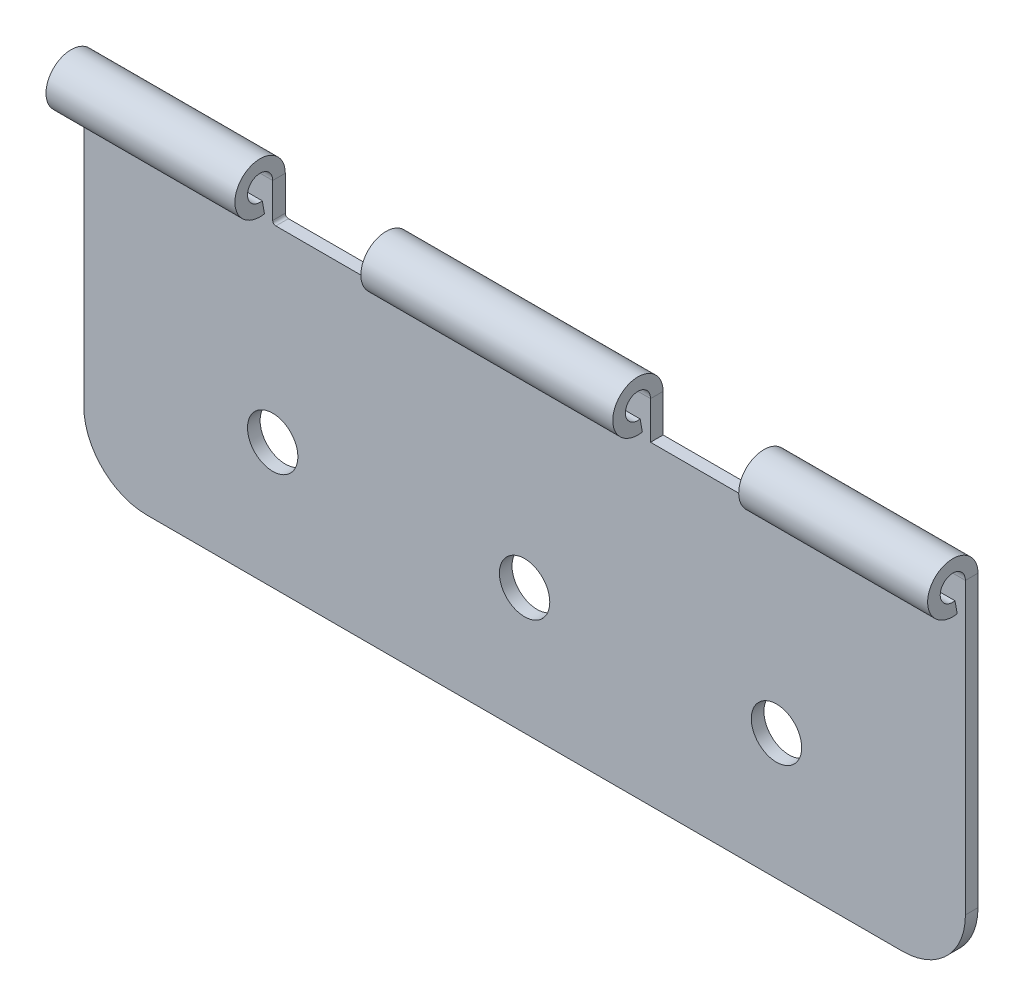
ISO-10303-21;
HEADER;
FILE_DESCRIPTION(('STEP AP214'),'2;1');
FILE_NAME('part.step','',(''),(''),'','','');
FILE_SCHEMA(('AUTOMOTIVE_DESIGN { 1 0 10303 214 1 1 1 1 }'));
ENDSEC;
DATA;
#1=APPLICATION_CONTEXT('core data for automotive mechanical design processes');
#2=APPLICATION_PROTOCOL_DEFINITION('international standard','automotive_design',2000,#1);
#3=PRODUCT_CONTEXT('',#1,'mechanical');
#4=PRODUCT('Part','Part','',(#3));
#5=PRODUCT_RELATED_PRODUCT_CATEGORY('part','',(#4));
#6=PRODUCT_DEFINITION_FORMATION('','',#4);
#7=PRODUCT_DEFINITION_CONTEXT('part definition',#1,'design');
#8=PRODUCT_DEFINITION('design','',#6,#7);
#9=PRODUCT_DEFINITION_SHAPE('','',#8);
#10=(LENGTH_UNIT() NAMED_UNIT(*) SI_UNIT(.MILLI.,.METRE.));
#11=(NAMED_UNIT(*) PLANE_ANGLE_UNIT() SI_UNIT($,.RADIAN.));
#12=(NAMED_UNIT(*) SI_UNIT($,.STERADIAN.) SOLID_ANGLE_UNIT());
#13=UNCERTAINTY_MEASURE_WITH_UNIT(LENGTH_MEASURE(1.E-05),#10,'distance_accuracy_value','');
#14=(GEOMETRIC_REPRESENTATION_CONTEXT(3) GLOBAL_UNCERTAINTY_ASSIGNED_CONTEXT((#13)) GLOBAL_UNIT_ASSIGNED_CONTEXT((#10,
#11,#12)) REPRESENTATION_CONTEXT('',''));
#15=CARTESIAN_POINT('',(0.,0.,0.));
#16=DIRECTION('',(0.,0.,1.));
#17=DIRECTION('',(1.,0.,0.));
#18=AXIS2_PLACEMENT_3D('',#15,#16,#17);
#19=CARTESIAN_POINT('',(55.,25.,-1.));
#20=DIRECTION('',(-1.,0.,0.));
#21=DIRECTION('',(0.,0.,1.));
#22=AXIS2_PLACEMENT_3D('',#19,#20,#21);
#23=PLANE('',#22);
#24=DIRECTION('',(0.,-1.,0.));
#25=VECTOR('',#24,1.);
#26=CARTESIAN_POINT('',(55.,25.,0.));
#27=LINE('',#26,#25);
#28=CARTESIAN_POINT('',(55.,28.,0.));
#29=VERTEX_POINT('',#28);
#30=CARTESIAN_POINT('',(55.,25.,0.));
#31=VERTEX_POINT('',#30);
#32=EDGE_CURVE('E347',#29,#31,#27,.T.);
#33=ORIENTED_EDGE('',*,*,#32,.F.);
#34=DIRECTION('',(0.,0.,-1.));
#35=VECTOR('',#34,1.);
#36=CARTESIAN_POINT('',(55.,28.,0.));
#37=LINE('',#36,#35);
#38=CARTESIAN_POINT('',(55.,28.,-1.));
#39=VERTEX_POINT('',#38);
#40=EDGE_CURVE('E205',#29,#39,#37,.T.);
#41=ORIENTED_EDGE('',*,*,#40,.T.);
#42=DIRECTION('',(0.,-1.,0.));
#43=VECTOR('',#42,1.);
#44=CARTESIAN_POINT('',(55.,25.,-1.));
#45=LINE('',#44,#43);
#46=CARTESIAN_POINT('',(55.,25.,-1.));
#47=VERTEX_POINT('',#46);
#48=EDGE_CURVE('E193',#39,#47,#45,.T.);
#49=ORIENTED_EDGE('',*,*,#48,.T.);
#50=DIRECTION('',(0.,0.,1.));
#51=VECTOR('',#50,1.);
#52=CARTESIAN_POINT('',(55.,25.,-1.));
#53=LINE('',#52,#51);
#54=EDGE_CURVE('E342',#47,#31,#53,.T.);
#55=ORIENTED_EDGE('',*,*,#54,.T.);
#56=EDGE_LOOP('',(#33,#41,#49,#55));
#57=FACE_BOUND('',#56,.T.);
#58=ADVANCED_FACE('F37',(#57),#23,.T.);
#59=CARTESIAN_POINT('',(25.,25.,-1.));
#60=DIRECTION('',(-1.,0.,0.));
#61=DIRECTION('',(0.,-1.,0.));
#62=AXIS2_PLACEMENT_3D('',#59,#60,#61);
#63=PLANE('',#62);
#64=DIRECTION('',(0.,-1.,0.));
#65=VECTOR('',#64,1.);
#66=CARTESIAN_POINT('',(25.,25.,-1.));
#67=LINE('',#66,#65);
#68=CARTESIAN_POINT('',(25.,28.,-1.));
#69=VERTEX_POINT('',#68);
#70=CARTESIAN_POINT('',(25.,25.25,-1.));
#71=VERTEX_POINT('',#70);
#72=EDGE_CURVE('E332',#69,#71,#67,.T.);
#73=ORIENTED_EDGE('',*,*,#72,.T.);
#74=DIRECTION('',(0.,0.,1.));
#75=VECTOR('',#74,1.);
#76=CARTESIAN_POINT('',(25.,25.25,0.));
#77=LINE('',#76,#75);
#78=CARTESIAN_POINT('',(25.,25.25,0.));
#79=VERTEX_POINT('',#78);
#80=EDGE_CURVE('E367',#71,#79,#77,.T.);
#81=ORIENTED_EDGE('',*,*,#80,.T.);
#82=DIRECTION('',(0.,-1.,0.));
#83=VECTOR('',#82,1.);
#84=CARTESIAN_POINT('',(25.,25.,0.));
#85=LINE('',#84,#83);
#86=CARTESIAN_POINT('',(25.,28.,0.));
#87=VERTEX_POINT('',#86);
#88=EDGE_CURVE('E355',#87,#79,#85,.T.);
#89=ORIENTED_EDGE('',*,*,#88,.F.);
#90=DIRECTION('',(0.,0.,-1.));
#91=VECTOR('',#90,1.);
#92=CARTESIAN_POINT('',(25.,28.,0.));
#93=LINE('',#92,#91);
#94=EDGE_CURVE('E247',#87,#69,#93,.T.);
#95=ORIENTED_EDGE('',*,*,#94,.T.);
#96=EDGE_LOOP('',(#73,#81,#89,#95));
#97=FACE_BOUND('',#96,.T.);
#98=ADVANCED_FACE('F444',(#97),#63,.T.);
#99=CARTESIAN_POINT('',(0.,0.,-1.));
#100=DIRECTION('',(-1.,0.,0.));
#101=DIRECTION('',(0.,0.,1.));
#102=AXIS2_PLACEMENT_3D('',#99,#100,#101);
#103=PLANE('',#102);
#104=DIRECTION('',(0.,-1.,0.));
#105=VECTOR('',#104,1.);
#106=CARTESIAN_POINT('',(0.,0.,-1.));
#107=LINE('',#106,#105);
#108=CARTESIAN_POINT('',(0.,28.,-1.));
#109=VERTEX_POINT('',#108);
#110=CARTESIAN_POINT('',(0.,5.,-1.));
#111=VERTEX_POINT('',#110);
#112=EDGE_CURVE('E340',#109,#111,#107,.T.);
#113=ORIENTED_EDGE('',*,*,#112,.T.);
#114=DIRECTION('',(0.,0.,1.));
#115=VECTOR('',#114,1.);
#116=CARTESIAN_POINT('',(0.,5.,-1.));
#117=LINE('',#116,#115);
#118=CARTESIAN_POINT('',(0.,5.,0.));
#119=VERTEX_POINT('',#118);
#120=EDGE_CURVE('E11',#111,#119,#117,.T.);
#121=ORIENTED_EDGE('',*,*,#120,.T.);
#122=DIRECTION('',(0.,-1.,0.));
#123=VECTOR('',#122,1.);
#124=CARTESIAN_POINT('',(0.,0.,0.));
#125=LINE('',#124,#123);
#126=CARTESIAN_POINT('',(0.,28.,0.));
#127=VERTEX_POINT('',#126);
#128=EDGE_CURVE('E323',#127,#119,#125,.T.);
#129=ORIENTED_EDGE('',*,*,#128,.F.);
#130=DIRECTION('',(0.,0.,-1.));
#131=VECTOR('',#130,1.);
#132=CARTESIAN_POINT('',(0.,28.,0.));
#133=LINE('',#132,#131);
#134=EDGE_CURVE('E278',#127,#109,#133,.T.);
#135=ORIENTED_EDGE('',*,*,#134,.T.);
#136=EDGE_LOOP('',(#113,#121,#129,#135));
#137=FACE_BOUND('',#136,.T.);
#138=ADVANCED_FACE('F411',(#137),#103,.T.);
#139=CARTESIAN_POINT('',(70.,0.,-1.));
#140=DIRECTION('',(0.,-1.,0.));
#141=DIRECTION('',(0.,0.,-1.));
#142=AXIS2_PLACEMENT_3D('',#139,#140,#141);
#143=PLANE('',#142);
#144=DIRECTION('',(1.,0.,0.));
#145=VECTOR('',#144,1.);
#146=CARTESIAN_POINT('',(70.,0.,-1.));
#147=LINE('',#146,#145);
#148=CARTESIAN_POINT('',(5.,0.,-1.));
#149=VERTEX_POINT('',#148);
#150=CARTESIAN_POINT('',(65.,0.,-1.));
#151=VERTEX_POINT('',#150);
#152=EDGE_CURVE('E194',#149,#151,#147,.T.);
#153=ORIENTED_EDGE('',*,*,#152,.T.);
#154=DIRECTION('',(0.,0.,1.));
#155=VECTOR('',#154,1.);
#156=CARTESIAN_POINT('',(65.,0.,-1.));
#157=LINE('',#156,#155);
#158=CARTESIAN_POINT('',(65.,0.,0.));
#159=VERTEX_POINT('',#158);
#160=EDGE_CURVE('E389',#151,#159,#157,.T.);
#161=ORIENTED_EDGE('',*,*,#160,.T.);
#162=DIRECTION('',(1.,0.,0.));
#163=VECTOR('',#162,1.);
#164=CARTESIAN_POINT('',(70.,0.,0.));
#165=LINE('',#164,#163);
#166=CARTESIAN_POINT('',(5.,0.,0.));
#167=VERTEX_POINT('',#166);
#168=EDGE_CURVE('E319',#167,#159,#165,.T.);
#169=ORIENTED_EDGE('',*,*,#168,.F.);
#170=DIRECTION('',(0.,0.,1.));
#171=VECTOR('',#170,1.);
#172=CARTESIAN_POINT('',(5.,0.,-1.));
#173=LINE('',#172,#171);
#174=EDGE_CURVE('E387',#167,#149,#173,.F.);
#175=ORIENTED_EDGE('',*,*,#174,.T.);
#176=EDGE_LOOP('',(#153,#161,#169,#175));
#177=FACE_BOUND('',#176,.T.);
#178=ADVANCED_FACE('F400',(#177),#143,.T.);
#179=CARTESIAN_POINT('',(15.,30.,-1.));
#180=DIRECTION('',(1.,0.,0.));
#181=DIRECTION('',(0.,1.,0.));
#182=AXIS2_PLACEMENT_3D('',#179,#180,#181);
#183=PLANE('',#182);
#184=DIRECTION('',(0.,1.,0.));
#185=VECTOR('',#184,1.);
#186=CARTESIAN_POINT('',(15.,30.,0.));
#187=LINE('',#186,#185);
#188=CARTESIAN_POINT('',(15.,25.25,0.));
#189=VERTEX_POINT('',#188);
#190=CARTESIAN_POINT('',(15.,28.,0.));
#191=VERTEX_POINT('',#190);
#192=EDGE_CURVE('E361',#189,#191,#187,.T.);
#193=ORIENTED_EDGE('',*,*,#192,.F.);
#194=DIRECTION('',(0.,0.,1.));
#195=VECTOR('',#194,1.);
#196=CARTESIAN_POINT('',(15.,25.25,-1.));
#197=LINE('',#196,#195);
#198=CARTESIAN_POINT('',(15.,25.25,-1.));
#199=VERTEX_POINT('',#198);
#200=EDGE_CURVE('E377',#189,#199,#197,.F.);
#201=ORIENTED_EDGE('',*,*,#200,.T.);
#202=DIRECTION('',(0.,1.,0.));
#203=VECTOR('',#202,1.);
#204=CARTESIAN_POINT('',(15.,30.,-1.));
#205=LINE('',#204,#203);
#206=CARTESIAN_POINT('',(15.,28.,-1.));
#207=VERTEX_POINT('',#206);
#208=EDGE_CURVE('E338',#199,#207,#205,.T.);
#209=ORIENTED_EDGE('',*,*,#208,.T.);
#210=DIRECTION('',(0.,0.,-1.));
#211=VECTOR('',#210,1.);
#212=CARTESIAN_POINT('',(15.,28.,0.));
#213=LINE('',#212,#211);
#214=EDGE_CURVE('E294',#191,#207,#213,.T.);
#215=ORIENTED_EDGE('',*,*,#214,.F.);
#216=EDGE_LOOP('',(#193,#201,#209,#215));
#217=FACE_BOUND('',#216,.T.);
#218=ADVANCED_FACE('F425',(#217),#183,.T.);
#219=CARTESIAN_POINT('',(15.,25.,-1.));
#220=DIRECTION('',(0.,1.,0.));
#221=DIRECTION('',(0.,0.,1.));
#222=AXIS2_PLACEMENT_3D('',#219,#220,#221);
#223=PLANE('',#222);
#224=DIRECTION('',(-1.,0.,0.));
#225=VECTOR('',#224,1.);
#226=CARTESIAN_POINT('',(15.,25.,0.));
#227=LINE('',#226,#225);
#228=CARTESIAN_POINT('',(24.75,25.,0.));
#229=VERTEX_POINT('',#228);
#230=CARTESIAN_POINT('',(15.25,25.,0.));
#231=VERTEX_POINT('',#230);
#232=EDGE_CURVE('E358',#229,#231,#227,.T.);
#233=ORIENTED_EDGE('',*,*,#232,.F.);
#234=DIRECTION('',(0.,0.,1.));
#235=VECTOR('',#234,1.);
#236=CARTESIAN_POINT('',(24.75,25.,-1.));
#237=LINE('',#236,#235);
#238=CARTESIAN_POINT('',(24.75,25.,-1.));
#239=VERTEX_POINT('',#238);
#240=EDGE_CURVE('E375',#229,#239,#237,.F.);
#241=ORIENTED_EDGE('',*,*,#240,.T.);
#242=DIRECTION('',(-1.,0.,0.));
#243=VECTOR('',#242,1.);
#244=CARTESIAN_POINT('',(15.,25.,-1.));
#245=LINE('',#244,#243);
#246=CARTESIAN_POINT('',(15.25,25.,-1.));
#247=VERTEX_POINT('',#246);
#248=EDGE_CURVE('E335',#239,#247,#245,.T.);
#249=ORIENTED_EDGE('',*,*,#248,.T.);
#250=DIRECTION('',(0.,0.,1.));
#251=VECTOR('',#250,1.);
#252=CARTESIAN_POINT('',(15.25,25.,0.));
#253=LINE('',#252,#251);
#254=EDGE_CURVE('E372',#247,#231,#253,.T.);
#255=ORIENTED_EDGE('',*,*,#254,.T.);
#256=EDGE_LOOP('',(#233,#241,#249,#255));
#257=FACE_BOUND('',#256,.T.);
#258=ADVANCED_FACE('F435',(#257),#223,.T.);
#259=CARTESIAN_POINT('',(45.,30.,-1.));
#260=DIRECTION('',(1.,0.,0.));
#261=DIRECTION('',(0.,1.,0.));
#262=AXIS2_PLACEMENT_3D('',#259,#260,#261);
#263=PLANE('',#262);
#264=DIRECTION('',(0.,0.,-1.));
#265=VECTOR('',#264,1.);
#266=CARTESIAN_POINT('',(45.,28.,0.));
#267=LINE('',#266,#265);
#268=CARTESIAN_POINT('',(45.,28.,0.));
#269=VERTEX_POINT('',#268);
#270=CARTESIAN_POINT('',(45.,28.,-1.));
#271=VERTEX_POINT('',#270);
#272=EDGE_CURVE('E262',#269,#271,#267,.T.);
#273=ORIENTED_EDGE('',*,*,#272,.F.);
#274=DIRECTION('',(0.,1.,0.));
#275=VECTOR('',#274,1.);
#276=CARTESIAN_POINT('',(45.,30.,0.));
#277=LINE('',#276,#275);
#278=CARTESIAN_POINT('',(45.,25.,0.));
#279=VERTEX_POINT('',#278);
#280=EDGE_CURVE('E352',#279,#269,#277,.T.);
#281=ORIENTED_EDGE('',*,*,#280,.F.);
#282=DIRECTION('',(0.,0.,1.));
#283=VECTOR('',#282,1.);
#284=CARTESIAN_POINT('',(45.,25.,-1.));
#285=LINE('',#284,#283);
#286=CARTESIAN_POINT('',(45.,25.,-1.));
#287=VERTEX_POINT('',#286);
#288=EDGE_CURVE('E365',#287,#279,#285,.T.);
#289=ORIENTED_EDGE('',*,*,#288,.F.);
#290=DIRECTION('',(0.,1.,0.));
#291=VECTOR('',#290,1.);
#292=CARTESIAN_POINT('',(45.,30.,-1.));
#293=LINE('',#292,#291);
#294=EDGE_CURVE('E329',#287,#271,#293,.T.);
#295=ORIENTED_EDGE('',*,*,#294,.T.);
#296=EDGE_LOOP('',(#273,#281,#289,#295));
#297=FACE_BOUND('',#296,.T.);
#298=ADVANCED_FACE('F453',(#297),#263,.T.);
#299=CARTESIAN_POINT('',(45.,25.,-1.));
#300=DIRECTION('',(0.,1.,0.));
#301=DIRECTION('',(0.,0.,1.));
#302=AXIS2_PLACEMENT_3D('',#299,#300,#301);
#303=PLANE('',#302);
#304=DIRECTION('',(-1.,0.,0.));
#305=VECTOR('',#304,1.);
#306=CARTESIAN_POINT('',(45.,25.,0.));
#307=LINE('',#306,#305);
#308=EDGE_CURVE('E349',#31,#279,#307,.T.);
#309=ORIENTED_EDGE('',*,*,#308,.F.);
#310=ORIENTED_EDGE('',*,*,#54,.F.);
#311=DIRECTION('',(-1.,0.,0.));
#312=VECTOR('',#311,1.);
#313=CARTESIAN_POINT('',(45.,25.,-1.));
#314=LINE('',#313,#312);
#315=EDGE_CURVE('E326',#47,#287,#314,.T.);
#316=ORIENTED_EDGE('',*,*,#315,.T.);
#317=ORIENTED_EDGE('',*,*,#288,.T.);
#318=EDGE_LOOP('',(#309,#310,#316,#317));
#319=FACE_BOUND('',#318,.T.);
#320=ADVANCED_FACE('F457',(#319),#303,.T.);
#321=CARTESIAN_POINT('',(70.,30.,-1.));
#322=DIRECTION('',(1.,0.,0.));
#323=DIRECTION('',(0.,0.,-1.));
#324=AXIS2_PLACEMENT_3D('',#321,#322,#323);
#325=PLANE('',#324);
#326=DIRECTION('',(0.,1.,0.));
#327=VECTOR('',#326,1.);
#328=CARTESIAN_POINT('',(70.,30.,0.));
#329=LINE('',#328,#327);
#330=CARTESIAN_POINT('',(70.,5.,0.));
#331=VERTEX_POINT('',#330);
#332=CARTESIAN_POINT('',(70.,28.,0.));
#333=VERTEX_POINT('',#332);
#334=EDGE_CURVE('E345',#331,#333,#329,.T.);
#335=ORIENTED_EDGE('',*,*,#334,.F.);
#336=DIRECTION('',(0.,0.,1.));
#337=VECTOR('',#336,1.);
#338=CARTESIAN_POINT('',(70.,5.,-1.));
#339=LINE('',#338,#337);
#340=CARTESIAN_POINT('',(70.,5.,-1.));
#341=VERTEX_POINT('',#340);
#342=EDGE_CURVE('E60',#331,#341,#339,.F.);
#343=ORIENTED_EDGE('',*,*,#342,.T.);
#344=DIRECTION('',(0.,1.,0.));
#345=VECTOR('',#344,1.);
#346=CARTESIAN_POINT('',(70.,30.,-1.));
#347=LINE('',#346,#345);
#348=CARTESIAN_POINT('',(70.,28.,-1.));
#349=VERTEX_POINT('',#348);
#350=EDGE_CURVE('E187',#341,#349,#347,.T.);
#351=ORIENTED_EDGE('',*,*,#350,.T.);
#352=DIRECTION('',(0.,0.,-1.));
#353=VECTOR('',#352,1.);
#354=CARTESIAN_POINT('',(70.,28.,0.));
#355=LINE('',#354,#353);
#356=EDGE_CURVE('E190',#333,#349,#355,.T.);
#357=ORIENTED_EDGE('',*,*,#356,.F.);
#358=EDGE_LOOP('',(#335,#343,#351,#357));
#359=FACE_BOUND('',#358,.T.);
#360=ADVANCED_FACE('F189',(#359),#325,.T.);
#361=CARTESIAN_POINT('',(0.,0.,-1.));
#362=DIRECTION('',(0.,0.,-1.));
#363=DIRECTION('',(-1.,0.,0.));
#364=AXIS2_PLACEMENT_3D('',#361,#362,#363);
#365=PLANE('',#364);
#366=ORIENTED_EDGE('',*,*,#350,.F.);
#367=CARTESIAN_POINT('',(65.,5.,-1.));
#368=DIRECTION('',(0.,0.,-1.));
#369=DIRECTION('',(-1.,0.,0.));
#370=AXIS2_PLACEMENT_3D('',#367,#368,#369);
#371=CIRCLE('',#370,5.);
#372=EDGE_CURVE('E45',#341,#151,#371,.T.);
#373=ORIENTED_EDGE('',*,*,#372,.T.);
#374=ORIENTED_EDGE('',*,*,#152,.F.);
#375=CARTESIAN_POINT('',(5.,5.,-1.));
#376=DIRECTION('',(0.,0.,-1.));
#377=DIRECTION('',(-1.,0.,0.));
#378=AXIS2_PLACEMENT_3D('',#375,#376,#377);
#379=CIRCLE('',#378,5.);
#380=EDGE_CURVE('E52',#149,#111,#379,.T.);
#381=ORIENTED_EDGE('',*,*,#380,.T.);
#382=ORIENTED_EDGE('',*,*,#112,.F.);
#383=DIRECTION('',(-1.,0.,0.));
#384=VECTOR('',#383,1.);
#385=CARTESIAN_POINT('',(0.,28.,-1.));
#386=LINE('',#385,#384);
#387=EDGE_CURVE('E271',#109,#207,#386,.F.);
#388=ORIENTED_EDGE('',*,*,#387,.T.);
#389=ORIENTED_EDGE('',*,*,#208,.F.);
#390=CARTESIAN_POINT('',(15.25,25.25,-1.));
#391=DIRECTION('',(0.,0.,-1.));
#392=DIRECTION('',(-1.,0.,0.));
#393=AXIS2_PLACEMENT_3D('',#390,#391,#392);
#394=CIRCLE('',#393,0.25);
#395=EDGE_CURVE('E385',#199,#247,#394,.F.);
#396=ORIENTED_EDGE('',*,*,#395,.T.);
#397=ORIENTED_EDGE('',*,*,#248,.F.);
#398=CARTESIAN_POINT('',(24.75,25.25,-1.));
#399=DIRECTION('',(0.,0.,-1.));
#400=DIRECTION('',(-1.,0.,0.));
#401=AXIS2_PLACEMENT_3D('',#398,#399,#400);
#402=CIRCLE('',#401,0.25);
#403=EDGE_CURVE('E381',#239,#71,#402,.F.);
#404=ORIENTED_EDGE('',*,*,#403,.T.);
#405=ORIENTED_EDGE('',*,*,#72,.F.);
#406=DIRECTION('',(-1.,0.,0.));
#407=VECTOR('',#406,1.);
#408=CARTESIAN_POINT('',(25.,28.,-1.));
#409=LINE('',#408,#407);
#410=EDGE_CURVE('E240',#69,#271,#409,.F.);
#411=ORIENTED_EDGE('',*,*,#410,.T.);
#412=ORIENTED_EDGE('',*,*,#294,.F.);
#413=ORIENTED_EDGE('',*,*,#315,.F.);
#414=ORIENTED_EDGE('',*,*,#48,.F.);
#415=DIRECTION('',(-1.,0.,0.));
#416=VECTOR('',#415,1.);
#417=CARTESIAN_POINT('',(55.,28.,-1.));
#418=LINE('',#417,#416);
#419=EDGE_CURVE('E211',#39,#349,#418,.F.);
#420=ORIENTED_EDGE('',*,*,#419,.T.);
#421=EDGE_LOOP('',(#366,#373,#374,#381,#382,#388,#389,#396,#397,#404,#405,#411,#412,#413,#414,#420));
#422=FACE_BOUND('',#421,.T.);
#423=CARTESIAN_POINT('',(55.,10.,-1.));
#424=DIRECTION('',(0.,0.,1.));
#425=DIRECTION('',(1.,0.,0.));
#426=AXIS2_PLACEMENT_3D('',#423,#424,#425);
#427=CIRCLE('',#426,2.);
#428=CARTESIAN_POINT('',(57.,10.,-1.));
#429=VERTEX_POINT('',#428);
#430=EDGE_CURVE('E304',#429,#429,#427,.T.);
#431=ORIENTED_EDGE('',*,*,#430,.T.);
#432=EDGE_LOOP('',(#431));
#433=FACE_BOUND('',#432,.T.);
#434=CARTESIAN_POINT('',(35.,10.,-1.));
#435=DIRECTION('',(0.,0.,1.));
#436=DIRECTION('',(1.,0.,0.));
#437=AXIS2_PLACEMENT_3D('',#434,#435,#436);
#438=CIRCLE('',#437,2.);
#439=CARTESIAN_POINT('',(37.,10.,-1.));
#440=VERTEX_POINT('',#439);
#441=EDGE_CURVE('E310',#440,#440,#438,.T.);
#442=ORIENTED_EDGE('',*,*,#441,.T.);
#443=EDGE_LOOP('',(#442));
#444=FACE_BOUND('',#443,.T.);
#445=CARTESIAN_POINT('',(15.,10.,-1.));
#446=DIRECTION('',(0.,0.,1.));
#447=DIRECTION('',(1.,0.,0.));
#448=AXIS2_PLACEMENT_3D('',#445,#446,#447);
#449=CIRCLE('',#448,2.);
#450=CARTESIAN_POINT('',(17.,10.,-1.));
#451=VERTEX_POINT('',#450);
#452=EDGE_CURVE('E316',#451,#451,#449,.T.);
#453=ORIENTED_EDGE('',*,*,#452,.T.);
#454=EDGE_LOOP('',(#453));
#455=FACE_BOUND('',#454,.T.);
#456=ADVANCED_FACE('F217',(#422,#433,#444,#455),#365,.T.);
#457=CARTESIAN_POINT('',(0.,0.,0.));
#458=DIRECTION('',(0.,0.,-1.));
#459=DIRECTION('',(-1.,0.,0.));
#460=AXIS2_PLACEMENT_3D('',#457,#458,#459);
#461=PLANE('',#460);
#462=CARTESIAN_POINT('',(55.,10.,0.));
#463=DIRECTION('',(0.,0.,1.));
#464=DIRECTION('',(1.,0.,0.));
#465=AXIS2_PLACEMENT_3D('',#462,#463,#464);
#466=CIRCLE('',#465,2.);
#467=CARTESIAN_POINT('',(57.,10.,0.));
#468=VERTEX_POINT('',#467);
#469=EDGE_CURVE('E301',#468,#468,#466,.T.);
#470=ORIENTED_EDGE('',*,*,#469,.F.);
#471=EDGE_LOOP('',(#470));
#472=FACE_BOUND('',#471,.T.);
#473=CARTESIAN_POINT('',(35.,10.,0.));
#474=DIRECTION('',(0.,0.,1.));
#475=DIRECTION('',(1.,0.,0.));
#476=AXIS2_PLACEMENT_3D('',#473,#474,#475);
#477=CIRCLE('',#476,2.);
#478=CARTESIAN_POINT('',(37.,10.,0.));
#479=VERTEX_POINT('',#478);
#480=EDGE_CURVE('E307',#479,#479,#477,.T.);
#481=ORIENTED_EDGE('',*,*,#480,.F.);
#482=EDGE_LOOP('',(#481));
#483=FACE_BOUND('',#482,.T.);
#484=CARTESIAN_POINT('',(15.,10.,0.));
#485=DIRECTION('',(0.,0.,1.));
#486=DIRECTION('',(1.,0.,0.));
#487=AXIS2_PLACEMENT_3D('',#484,#485,#486);
#488=CIRCLE('',#487,2.);
#489=CARTESIAN_POINT('',(17.,10.,0.));
#490=VERTEX_POINT('',#489);
#491=EDGE_CURVE('E313',#490,#490,#488,.T.);
#492=ORIENTED_EDGE('',*,*,#491,.F.);
#493=EDGE_LOOP('',(#492));
#494=FACE_BOUND('',#493,.T.);
#495=ORIENTED_EDGE('',*,*,#168,.T.);
#496=CARTESIAN_POINT('',(65.,5.,0.));
#497=DIRECTION('',(0.,0.,-1.));
#498=DIRECTION('',(-1.,0.,0.));
#499=AXIS2_PLACEMENT_3D('',#496,#497,#498);
#500=CIRCLE('',#499,5.);
#501=EDGE_CURVE('E394',#159,#331,#500,.F.);
#502=ORIENTED_EDGE('',*,*,#501,.T.);
#503=ORIENTED_EDGE('',*,*,#334,.T.);
#504=DIRECTION('',(-1.,0.,0.));
#505=VECTOR('',#504,1.);
#506=CARTESIAN_POINT('',(55.,28.,0.));
#507=LINE('',#506,#505);
#508=EDGE_CURVE('E226',#29,#333,#507,.F.);
#509=ORIENTED_EDGE('',*,*,#508,.F.);
#510=ORIENTED_EDGE('',*,*,#32,.T.);
#511=ORIENTED_EDGE('',*,*,#308,.T.);
#512=ORIENTED_EDGE('',*,*,#280,.T.);
#513=DIRECTION('',(-1.,0.,0.));
#514=VECTOR('',#513,1.);
#515=CARTESIAN_POINT('',(25.,28.,0.));
#516=LINE('',#515,#514);
#517=EDGE_CURVE('E256',#87,#269,#516,.F.);
#518=ORIENTED_EDGE('',*,*,#517,.F.);
#519=ORIENTED_EDGE('',*,*,#88,.T.);
#520=CARTESIAN_POINT('',(24.75,25.25,0.));
#521=DIRECTION('',(0.,0.,-1.));
#522=DIRECTION('',(-1.,0.,0.));
#523=AXIS2_PLACEMENT_3D('',#520,#521,#522);
#524=CIRCLE('',#523,0.25);
#525=EDGE_CURVE('E379',#79,#229,#524,.T.);
#526=ORIENTED_EDGE('',*,*,#525,.T.);
#527=ORIENTED_EDGE('',*,*,#232,.T.);
#528=CARTESIAN_POINT('',(15.25,25.25,0.));
#529=DIRECTION('',(0.,0.,-1.));
#530=DIRECTION('',(-1.,0.,0.));
#531=AXIS2_PLACEMENT_3D('',#528,#529,#530);
#532=CIRCLE('',#531,0.25);
#533=EDGE_CURVE('E383',#231,#189,#532,.T.);
#534=ORIENTED_EDGE('',*,*,#533,.T.);
#535=ORIENTED_EDGE('',*,*,#192,.T.);
#536=DIRECTION('',(-1.,0.,0.));
#537=VECTOR('',#536,1.);
#538=CARTESIAN_POINT('',(0.,28.,0.));
#539=LINE('',#538,#537);
#540=EDGE_CURVE('E287',#127,#191,#539,.F.);
#541=ORIENTED_EDGE('',*,*,#540,.F.);
#542=ORIENTED_EDGE('',*,*,#128,.T.);
#543=CARTESIAN_POINT('',(5.,5.,0.));
#544=DIRECTION('',(0.,0.,-1.));
#545=DIRECTION('',(-1.,0.,0.));
#546=AXIS2_PLACEMENT_3D('',#543,#544,#545);
#547=CIRCLE('',#546,5.);
#548=EDGE_CURVE('E392',#119,#167,#547,.F.);
#549=ORIENTED_EDGE('',*,*,#548,.T.);
#550=EDGE_LOOP('',(#495,#502,#503,#509,#510,#511,#512,#518,#519,#526,#527,#534,#535,#541,#542,#549));
#551=FACE_BOUND('',#550,.T.);
#552=ADVANCED_FACE('F405',(#472,#483,#494,#551),#461,.F.);
#553=CARTESIAN_POINT('',(15.,10.,-1.));
#554=DIRECTION('',(0.,0.,1.));
#555=DIRECTION('',(1.,0.,0.));
#556=AXIS2_PLACEMENT_3D('',#553,#554,#555);
#557=CYLINDRICAL_SURFACE('',#556,2.);
#558=ORIENTED_EDGE('',*,*,#452,.F.);
#559=EDGE_LOOP('',(#558));
#560=FACE_BOUND('',#559,.T.);
#561=ORIENTED_EDGE('',*,*,#491,.T.);
#562=EDGE_LOOP('',(#561));
#563=FACE_BOUND('',#562,.T.);
#564=ADVANCED_FACE('F520',(#560,#563),#557,.F.);
#565=CARTESIAN_POINT('',(35.,10.,-1.));
#566=DIRECTION('',(0.,0.,1.));
#567=DIRECTION('',(1.,0.,0.));
#568=AXIS2_PLACEMENT_3D('',#565,#566,#567);
#569=CYLINDRICAL_SURFACE('',#568,2.);
#570=ORIENTED_EDGE('',*,*,#441,.F.);
#571=EDGE_LOOP('',(#570));
#572=FACE_BOUND('',#571,.T.);
#573=ORIENTED_EDGE('',*,*,#480,.T.);
#574=EDGE_LOOP('',(#573));
#575=FACE_BOUND('',#574,.T.);
#576=ADVANCED_FACE('F755',(#572,#575),#569,.F.);
#577=CARTESIAN_POINT('',(55.,10.,-1.));
#578=DIRECTION('',(0.,0.,1.));
#579=DIRECTION('',(1.,0.,0.));
#580=AXIS2_PLACEMENT_3D('',#577,#578,#579);
#581=CYLINDRICAL_SURFACE('',#580,2.);
#582=ORIENTED_EDGE('',*,*,#430,.F.);
#583=EDGE_LOOP('',(#582));
#584=FACE_BOUND('',#583,.T.);
#585=ORIENTED_EDGE('',*,*,#469,.T.);
#586=EDGE_LOOP('',(#585));
#587=FACE_BOUND('',#586,.T.);
#588=ADVANCED_FACE('F735',(#584,#587),#581,.F.);
#589=CARTESIAN_POINT('',(7.5,27.0151922469878,0.826351822333061));
#590=DIRECTION('',(0.,-0.173648177666938,0.984807753012207));
#591=DIRECTION('',(-1.,0.,0.));
#592=AXIS2_PLACEMENT_3D('',#589,#590,#591);
#593=PLANE('',#592);
#594=DIRECTION('',(0.,-0.984807753012207,-0.173648177666938));
#595=VECTOR('',#594,1.);
#596=CARTESIAN_POINT('',(0.,27.0151922469878,0.826351822333061));
#597=LINE('',#596,#595);
#598=CARTESIAN_POINT('',(0.,27.0151922469878,0.826351822333061));
#599=VERTEX_POINT('',#598);
#600=CARTESIAN_POINT('',(0.,26.0303844939756,0.652703644666123));
#601=VERTEX_POINT('',#600);
#602=EDGE_CURVE('E299',#599,#601,#597,.T.);
#603=ORIENTED_EDGE('',*,*,#602,.F.);
#604=DIRECTION('',(-1.,0.,0.));
#605=VECTOR('',#604,1.);
#606=CARTESIAN_POINT('',(0.,27.0151922469878,0.826351822333061));
#607=LINE('',#606,#605);
#608=CARTESIAN_POINT('',(15.,27.0151922469878,0.826351822333061));
#609=VERTEX_POINT('',#608);
#610=EDGE_CURVE('E268',#609,#599,#607,.T.);
#611=ORIENTED_EDGE('',*,*,#610,.F.);
#612=DIRECTION('',(0.,-0.984807753012207,-0.173648177666938));
#613=VECTOR('',#612,1.);
#614=CARTESIAN_POINT('',(15.,27.0151922469878,0.826351822333061));
#615=LINE('',#614,#613);
#616=CARTESIAN_POINT('',(15.,26.0303844939756,0.652703644666123));
#617=VERTEX_POINT('',#616);
#618=EDGE_CURVE('E297',#609,#617,#615,.T.);
#619=ORIENTED_EDGE('',*,*,#618,.T.);
#620=DIRECTION('',(-1.,0.,0.));
#621=VECTOR('',#620,1.);
#622=CARTESIAN_POINT('',(0.,26.0303844939756,0.652703644666123));
#623=LINE('',#622,#621);
#624=EDGE_CURVE('E279',#617,#601,#623,.T.);
#625=ORIENTED_EDGE('',*,*,#624,.T.);
#626=EDGE_LOOP('',(#603,#611,#619,#625));
#627=FACE_BOUND('',#626,.T.);
#628=ADVANCED_FACE('F725',(#627),#593,.F.);
#629=CARTESIAN_POINT('',(15.,28.,1.));
#630=DIRECTION('',(1.,0.,0.));
#631=DIRECTION('',(0.,0.,-1.));
#632=AXIS2_PLACEMENT_3D('',#629,#630,#631);
#633=PLANE('',#632);
#634=ORIENTED_EDGE('',*,*,#618,.F.);
#635=CARTESIAN_POINT('',(15.,28.,1.));
#636=DIRECTION('',(-1.,0.,0.));
#637=DIRECTION('',(0.,0.,1.));
#638=AXIS2_PLACEMENT_3D('',#635,#636,#637);
#639=CIRCLE('',#638,1.);
#640=EDGE_CURVE('E282',#191,#609,#639,.F.);
#641=ORIENTED_EDGE('',*,*,#640,.F.);
#642=ORIENTED_EDGE('',*,*,#214,.T.);
#643=CARTESIAN_POINT('',(15.,28.,1.));
#644=DIRECTION('',(-1.,0.,0.));
#645=DIRECTION('',(0.,0.,1.));
#646=AXIS2_PLACEMENT_3D('',#643,#644,#645);
#647=CIRCLE('',#646,2.);
#648=EDGE_CURVE('E274',#207,#617,#647,.F.);
#649=ORIENTED_EDGE('',*,*,#648,.T.);
#650=EDGE_LOOP('',(#634,#641,#642,#649));
#651=FACE_BOUND('',#650,.T.);
#652=ADVANCED_FACE('F421',(#651),#633,.T.);
#653=CARTESIAN_POINT('',(0.,28.,1.));
#654=DIRECTION('',(1.,0.,0.));
#655=DIRECTION('',(0.,0.,-1.));
#656=AXIS2_PLACEMENT_3D('',#653,#654,#655);
#657=PLANE('',#656);
#658=CARTESIAN_POINT('',(0.,28.,1.));
#659=DIRECTION('',(-1.,0.,0.));
#660=DIRECTION('',(0.,0.,1.));
#661=AXIS2_PLACEMENT_3D('',#658,#659,#660);
#662=CIRCLE('',#661,1.);
#663=EDGE_CURVE('E290',#599,#127,#662,.T.);
#664=ORIENTED_EDGE('',*,*,#663,.F.);
#665=ORIENTED_EDGE('',*,*,#602,.T.);
#666=CARTESIAN_POINT('',(0.,28.,1.));
#667=DIRECTION('',(-1.,0.,0.));
#668=DIRECTION('',(0.,0.,1.));
#669=AXIS2_PLACEMENT_3D('',#666,#667,#668);
#670=CIRCLE('',#669,2.);
#671=EDGE_CURVE('E275',#601,#109,#670,.T.);
#672=ORIENTED_EDGE('',*,*,#671,.T.);
#673=ORIENTED_EDGE('',*,*,#134,.F.);
#674=EDGE_LOOP('',(#664,#665,#672,#673));
#675=FACE_BOUND('',#674,.T.);
#676=ADVANCED_FACE('F704',(#675),#657,.F.);
#677=CARTESIAN_POINT('',(0.,28.,1.));
#678=DIRECTION('',(-1.,0.,0.));
#679=DIRECTION('',(0.,-0.984807753012207,-0.173648177666938));
#680=AXIS2_PLACEMENT_3D('',#677,#678,#679);
#681=CYLINDRICAL_SURFACE('',#680,2.);
#682=ORIENTED_EDGE('',*,*,#387,.F.);
#683=ORIENTED_EDGE('',*,*,#671,.F.);
#684=ORIENTED_EDGE('',*,*,#624,.F.);
#685=ORIENTED_EDGE('',*,*,#648,.F.);
#686=EDGE_LOOP('',(#682,#683,#684,#685));
#687=FACE_BOUND('',#686,.T.);
#688=ADVANCED_FACE('F695',(#687),#681,.T.);
#689=CARTESIAN_POINT('',(0.,28.,1.));
#690=DIRECTION('',(-1.,0.,0.));
#691=DIRECTION('',(0.,-0.984807753012207,-0.173648177666938));
#692=AXIS2_PLACEMENT_3D('',#689,#690,#691);
#693=CYLINDRICAL_SURFACE('',#692,1.);
#694=ORIENTED_EDGE('',*,*,#540,.T.);
#695=ORIENTED_EDGE('',*,*,#640,.T.);
#696=ORIENTED_EDGE('',*,*,#610,.T.);
#697=ORIENTED_EDGE('',*,*,#663,.T.);
#698=EDGE_LOOP('',(#694,#695,#696,#697));
#699=FACE_BOUND('',#698,.T.);
#700=ADVANCED_FACE('F416',(#699),#693,.F.);
#701=CARTESIAN_POINT('',(35.,27.0151922469878,0.826351822333061));
#702=DIRECTION('',(0.,-0.173648177666938,0.984807753012207));
#703=DIRECTION('',(-1.,0.,0.));
#704=AXIS2_PLACEMENT_3D('',#701,#702,#703);
#705=PLANE('',#704);
#706=DIRECTION('',(0.,-0.984807753012207,-0.173648177666938));
#707=VECTOR('',#706,1.);
#708=CARTESIAN_POINT('',(25.,27.0151922469878,0.826351822333061));
#709=LINE('',#708,#707);
#710=CARTESIAN_POINT('',(25.,27.0151922469878,0.826351822333061));
#711=VERTEX_POINT('',#710);
#712=CARTESIAN_POINT('',(25.,26.0303844939756,0.652703644666123));
#713=VERTEX_POINT('',#712);
#714=EDGE_CURVE('E266',#711,#713,#709,.T.);
#715=ORIENTED_EDGE('',*,*,#714,.F.);
#716=DIRECTION('',(-1.,0.,0.));
#717=VECTOR('',#716,1.);
#718=CARTESIAN_POINT('',(25.,27.0151922469878,0.826351822333061));
#719=LINE('',#718,#717);
#720=CARTESIAN_POINT('',(45.,27.0151922469878,0.826351822333061));
#721=VERTEX_POINT('',#720);
#722=EDGE_CURVE('E237',#721,#711,#719,.T.);
#723=ORIENTED_EDGE('',*,*,#722,.F.);
#724=DIRECTION('',(0.,-0.984807753012207,-0.173648177666938));
#725=VECTOR('',#724,1.);
#726=CARTESIAN_POINT('',(45.,27.0151922469878,0.826351822333061));
#727=LINE('',#726,#725);
#728=CARTESIAN_POINT('',(45.,26.0303844939756,0.652703644666123));
#729=VERTEX_POINT('',#728);
#730=EDGE_CURVE('E264',#721,#729,#727,.T.);
#731=ORIENTED_EDGE('',*,*,#730,.T.);
#732=DIRECTION('',(-1.,0.,0.));
#733=VECTOR('',#732,1.);
#734=CARTESIAN_POINT('',(25.,26.0303844939756,0.652703644666123));
#735=LINE('',#734,#733);
#736=EDGE_CURVE('E248',#729,#713,#735,.T.);
#737=ORIENTED_EDGE('',*,*,#736,.T.);
#738=EDGE_LOOP('',(#715,#723,#731,#737));
#739=FACE_BOUND('',#738,.T.);
#740=ADVANCED_FACE('F675',(#739),#705,.F.);
#741=CARTESIAN_POINT('',(45.,28.,1.));
#742=DIRECTION('',(1.,0.,0.));
#743=DIRECTION('',(0.,0.,-1.));
#744=AXIS2_PLACEMENT_3D('',#741,#742,#743);
#745=PLANE('',#744);
#746=ORIENTED_EDGE('',*,*,#730,.F.);
#747=CARTESIAN_POINT('',(45.,28.,1.));
#748=DIRECTION('',(-1.,0.,0.));
#749=DIRECTION('',(0.,0.,1.));
#750=AXIS2_PLACEMENT_3D('',#747,#748,#749);
#751=CIRCLE('',#750,1.);
#752=EDGE_CURVE('E251',#269,#721,#751,.F.);
#753=ORIENTED_EDGE('',*,*,#752,.F.);
#754=ORIENTED_EDGE('',*,*,#272,.T.);
#755=CARTESIAN_POINT('',(45.,28.,1.));
#756=DIRECTION('',(-1.,0.,0.));
#757=DIRECTION('',(0.,0.,1.));
#758=AXIS2_PLACEMENT_3D('',#755,#756,#757);
#759=CIRCLE('',#758,2.);
#760=EDGE_CURVE('E243',#271,#729,#759,.F.);
#761=ORIENTED_EDGE('',*,*,#760,.T.);
#762=EDGE_LOOP('',(#746,#753,#754,#761));
#763=FACE_BOUND('',#762,.T.);
#764=ADVANCED_FACE('F664',(#763),#745,.T.);
#765=CARTESIAN_POINT('',(25.,28.,1.));
#766=DIRECTION('',(1.,0.,0.));
#767=DIRECTION('',(0.,0.,-1.));
#768=AXIS2_PLACEMENT_3D('',#765,#766,#767);
#769=PLANE('',#768);
#770=CARTESIAN_POINT('',(25.,28.,1.));
#771=DIRECTION('',(-1.,0.,0.));
#772=DIRECTION('',(0.,0.,1.));
#773=AXIS2_PLACEMENT_3D('',#770,#771,#772);
#774=CIRCLE('',#773,1.);
#775=EDGE_CURVE('E258',#711,#87,#774,.T.);
#776=ORIENTED_EDGE('',*,*,#775,.F.);
#777=ORIENTED_EDGE('',*,*,#714,.T.);
#778=CARTESIAN_POINT('',(25.,28.,1.));
#779=DIRECTION('',(-1.,0.,0.));
#780=DIRECTION('',(0.,0.,1.));
#781=AXIS2_PLACEMENT_3D('',#778,#779,#780);
#782=CIRCLE('',#781,2.);
#783=EDGE_CURVE('E244',#713,#69,#782,.T.);
#784=ORIENTED_EDGE('',*,*,#783,.T.);
#785=ORIENTED_EDGE('',*,*,#94,.F.);
#786=EDGE_LOOP('',(#776,#777,#784,#785));
#787=FACE_BOUND('',#786,.T.);
#788=ADVANCED_FACE('F654',(#787),#769,.F.);
#789=CARTESIAN_POINT('',(25.,28.,1.));
#790=DIRECTION('',(-1.,0.,0.));
#791=DIRECTION('',(0.,-0.984807753012207,-0.173648177666938));
#792=AXIS2_PLACEMENT_3D('',#789,#790,#791);
#793=CYLINDRICAL_SURFACE('',#792,2.);
#794=ORIENTED_EDGE('',*,*,#410,.F.);
#795=ORIENTED_EDGE('',*,*,#783,.F.);
#796=ORIENTED_EDGE('',*,*,#736,.F.);
#797=ORIENTED_EDGE('',*,*,#760,.F.);
#798=EDGE_LOOP('',(#794,#795,#796,#797));
#799=FACE_BOUND('',#798,.T.);
#800=ADVANCED_FACE('F478',(#799),#793,.T.);
#801=CARTESIAN_POINT('',(25.,28.,1.));
#802=DIRECTION('',(-1.,0.,0.));
#803=DIRECTION('',(0.,-0.984807753012207,-0.173648177666938));
#804=AXIS2_PLACEMENT_3D('',#801,#802,#803);
#805=CYLINDRICAL_SURFACE('',#804,1.);
#806=ORIENTED_EDGE('',*,*,#517,.T.);
#807=ORIENTED_EDGE('',*,*,#752,.T.);
#808=ORIENTED_EDGE('',*,*,#722,.T.);
#809=ORIENTED_EDGE('',*,*,#775,.T.);
#810=EDGE_LOOP('',(#806,#807,#808,#809));
#811=FACE_BOUND('',#810,.T.);
#812=ADVANCED_FACE('F471',(#811),#805,.F.);
#813=CARTESIAN_POINT('',(62.5,27.0151922469878,0.826351822333061));
#814=DIRECTION('',(0.,-0.173648177666938,0.984807753012207));
#815=DIRECTION('',(-1.,0.,0.));
#816=AXIS2_PLACEMENT_3D('',#813,#814,#815);
#817=PLANE('',#816);
#818=DIRECTION('',(0.,-0.984807753012207,-0.173648177666938));
#819=VECTOR('',#818,1.);
#820=CARTESIAN_POINT('',(55.,27.0151922469878,0.826351822333061));
#821=LINE('',#820,#819);
#822=CARTESIAN_POINT('',(55.,27.0151922469878,0.826351822333061));
#823=VERTEX_POINT('',#822);
#824=CARTESIAN_POINT('',(55.,26.0303844939756,0.652703644666123));
#825=VERTEX_POINT('',#824);
#826=EDGE_CURVE('E235',#823,#825,#821,.T.);
#827=ORIENTED_EDGE('',*,*,#826,.F.);
#828=DIRECTION('',(-1.,0.,0.));
#829=VECTOR('',#828,1.);
#830=CARTESIAN_POINT('',(55.,27.0151922469878,0.826351822333061));
#831=LINE('',#830,#829);
#832=CARTESIAN_POINT('',(70.,27.0151922469878,0.826351822333061));
#833=VERTEX_POINT('',#832);
#834=EDGE_CURVE('E231',#833,#823,#831,.T.);
#835=ORIENTED_EDGE('',*,*,#834,.F.);
#836=DIRECTION('',(0.,-0.984807753012207,-0.173648177666938));
#837=VECTOR('',#836,1.);
#838=CARTESIAN_POINT('',(70.,27.0151922469878,0.826351822333061));
#839=LINE('',#838,#837);
#840=CARTESIAN_POINT('',(70.,26.0303844939756,0.652703644666123));
#841=VERTEX_POINT('',#840);
#842=EDGE_CURVE('E204',#833,#841,#839,.T.);
#843=ORIENTED_EDGE('',*,*,#842,.T.);
#844=DIRECTION('',(-1.,0.,0.));
#845=VECTOR('',#844,1.);
#846=CARTESIAN_POINT('',(55.,26.0303844939756,0.652703644666123));
#847=LINE('',#846,#845);
#848=EDGE_CURVE('E214',#841,#825,#847,.T.);
#849=ORIENTED_EDGE('',*,*,#848,.T.);
#850=EDGE_LOOP('',(#827,#835,#843,#849));
#851=FACE_BOUND('',#850,.T.);
#852=ADVANCED_FACE('F469',(#851),#817,.F.);
#853=CARTESIAN_POINT('',(70.,28.,1.));
#854=DIRECTION('',(1.,0.,0.));
#855=DIRECTION('',(0.,0.,-1.));
#856=AXIS2_PLACEMENT_3D('',#853,#854,#855);
#857=PLANE('',#856);
#858=ORIENTED_EDGE('',*,*,#842,.F.);
#859=CARTESIAN_POINT('',(70.,28.,1.));
#860=DIRECTION('',(-1.,0.,0.));
#861=DIRECTION('',(0.,0.,1.));
#862=AXIS2_PLACEMENT_3D('',#859,#860,#861);
#863=CIRCLE('',#862,1.);
#864=EDGE_CURVE('E203',#333,#833,#863,.F.);
#865=ORIENTED_EDGE('',*,*,#864,.F.);
#866=ORIENTED_EDGE('',*,*,#356,.T.);
#867=CARTESIAN_POINT('',(70.,28.,1.));
#868=DIRECTION('',(-1.,0.,0.));
#869=DIRECTION('',(0.,0.,1.));
#870=AXIS2_PLACEMENT_3D('',#867,#868,#869);
#871=CIRCLE('',#870,2.);
#872=EDGE_CURVE('E201',#349,#841,#871,.F.);
#873=ORIENTED_EDGE('',*,*,#872,.T.);
#874=EDGE_LOOP('',(#858,#865,#866,#873));
#875=FACE_BOUND('',#874,.T.);
#876=ADVANCED_FACE('F200',(#875),#857,.T.);
#877=CARTESIAN_POINT('',(55.,28.,1.));
#878=DIRECTION('',(1.,0.,0.));
#879=DIRECTION('',(0.,0.,-1.));
#880=AXIS2_PLACEMENT_3D('',#877,#878,#879);
#881=PLANE('',#880);
#882=CARTESIAN_POINT('',(55.,28.,1.));
#883=DIRECTION('',(-1.,0.,0.));
#884=DIRECTION('',(0.,0.,1.));
#885=AXIS2_PLACEMENT_3D('',#882,#883,#884);
#886=CIRCLE('',#885,1.);
#887=EDGE_CURVE('E229',#823,#29,#886,.T.);
#888=ORIENTED_EDGE('',*,*,#887,.F.);
#889=ORIENTED_EDGE('',*,*,#826,.T.);
#890=CARTESIAN_POINT('',(55.,28.,1.));
#891=DIRECTION('',(-1.,0.,0.));
#892=DIRECTION('',(0.,0.,1.));
#893=AXIS2_PLACEMENT_3D('',#890,#891,#892);
#894=CIRCLE('',#893,2.);
#895=EDGE_CURVE('E220',#825,#39,#894,.T.);
#896=ORIENTED_EDGE('',*,*,#895,.T.);
#897=ORIENTED_EDGE('',*,*,#40,.F.);
#898=EDGE_LOOP('',(#888,#889,#896,#897));
#899=FACE_BOUND('',#898,.T.);
#900=ADVANCED_FACE('F464',(#899),#881,.F.);
#901=CARTESIAN_POINT('',(55.,28.,1.));
#902=DIRECTION('',(-1.,0.,0.));
#903=DIRECTION('',(0.,-0.984807753012207,-0.173648177666938));
#904=AXIS2_PLACEMENT_3D('',#901,#902,#903);
#905=CYLINDRICAL_SURFACE('',#904,2.);
#906=ORIENTED_EDGE('',*,*,#419,.F.);
#907=ORIENTED_EDGE('',*,*,#895,.F.);
#908=ORIENTED_EDGE('',*,*,#848,.F.);
#909=ORIENTED_EDGE('',*,*,#872,.F.);
#910=EDGE_LOOP('',(#906,#907,#908,#909));
#911=FACE_BOUND('',#910,.T.);
#912=ADVANCED_FACE('F209',(#911),#905,.T.);
#913=CARTESIAN_POINT('',(55.,28.,1.));
#914=DIRECTION('',(-1.,0.,0.));
#915=DIRECTION('',(0.,-0.984807753012207,-0.173648177666938));
#916=AXIS2_PLACEMENT_3D('',#913,#914,#915);
#917=CYLINDRICAL_SURFACE('',#916,1.);
#918=ORIENTED_EDGE('',*,*,#508,.T.);
#919=ORIENTED_EDGE('',*,*,#864,.T.);
#920=ORIENTED_EDGE('',*,*,#834,.T.);
#921=ORIENTED_EDGE('',*,*,#887,.T.);
#922=EDGE_LOOP('',(#918,#919,#920,#921));
#923=FACE_BOUND('',#922,.T.);
#924=ADVANCED_FACE('F466',(#923),#917,.F.);
#925=CARTESIAN_POINT('',(24.75,25.25,-1.));
#926=DIRECTION('',(0.,0.,-1.));
#927=DIRECTION('',(-1.,0.,0.));
#928=AXIS2_PLACEMENT_3D('',#925,#926,#927);
#929=CYLINDRICAL_SURFACE('',#928,0.25);
#930=ORIENTED_EDGE('',*,*,#403,.F.);
#931=ORIENTED_EDGE('',*,*,#240,.F.);
#932=ORIENTED_EDGE('',*,*,#525,.F.);
#933=ORIENTED_EDGE('',*,*,#80,.F.);
#934=EDGE_LOOP('',(#930,#931,#932,#933));
#935=FACE_BOUND('',#934,.T.);
#936=ADVANCED_FACE('F442',(#935),#929,.F.);
#937=CARTESIAN_POINT('',(15.25,25.25,-1.));
#938=DIRECTION('',(0.,0.,-1.));
#939=DIRECTION('',(-1.,0.,0.));
#940=AXIS2_PLACEMENT_3D('',#937,#938,#939);
#941=CYLINDRICAL_SURFACE('',#940,0.25);
#942=ORIENTED_EDGE('',*,*,#395,.F.);
#943=ORIENTED_EDGE('',*,*,#200,.F.);
#944=ORIENTED_EDGE('',*,*,#533,.F.);
#945=ORIENTED_EDGE('',*,*,#254,.F.);
#946=EDGE_LOOP('',(#942,#943,#944,#945));
#947=FACE_BOUND('',#946,.T.);
#948=ADVANCED_FACE('F432',(#947),#941,.F.);
#949=CARTESIAN_POINT('',(65.,5.,-1.));
#950=DIRECTION('',(0.,0.,1.));
#951=DIRECTION('',(1.,0.,0.));
#952=AXIS2_PLACEMENT_3D('',#949,#950,#951);
#953=CYLINDRICAL_SURFACE('',#952,5.);
#954=ORIENTED_EDGE('',*,*,#372,.F.);
#955=ORIENTED_EDGE('',*,*,#342,.F.);
#956=ORIENTED_EDGE('',*,*,#501,.F.);
#957=ORIENTED_EDGE('',*,*,#160,.F.);
#958=EDGE_LOOP('',(#954,#955,#956,#957));
#959=FACE_BOUND('',#958,.T.);
#960=ADVANCED_FACE('F403',(#959),#953,.T.);
#961=CARTESIAN_POINT('',(5.,5.,-1.));
#962=DIRECTION('',(0.,0.,1.));
#963=DIRECTION('',(1.,0.,0.));
#964=AXIS2_PLACEMENT_3D('',#961,#962,#963);
#965=CYLINDRICAL_SURFACE('',#964,5.);
#966=ORIENTED_EDGE('',*,*,#380,.F.);
#967=ORIENTED_EDGE('',*,*,#174,.F.);
#968=ORIENTED_EDGE('',*,*,#548,.F.);
#969=ORIENTED_EDGE('',*,*,#120,.F.);
#970=EDGE_LOOP('',(#966,#967,#968,#969));
#971=FACE_BOUND('',#970,.T.);
#972=ADVANCED_FACE('F39',(#971),#965,.T.);
#973=CLOSED_SHELL('',(#58,#98,#138,#178,#218,#258,#298,#320,#360,#456,#552,#564,#576,#588,#628,
#652,#676,#688,#700,#740,#764,#788,#800,#812,#852,#876,#900,#912,#924,#936,#948,#960,#972));
#974=MANIFOLD_SOLID_BREP('B2',#973);
#975=ADVANCED_BREP_SHAPE_REPRESENTATION('',(#18,#974),#14);
#976=SHAPE_DEFINITION_REPRESENTATION(#9,#975);
ENDSEC;
END-ISO-10303-21;
